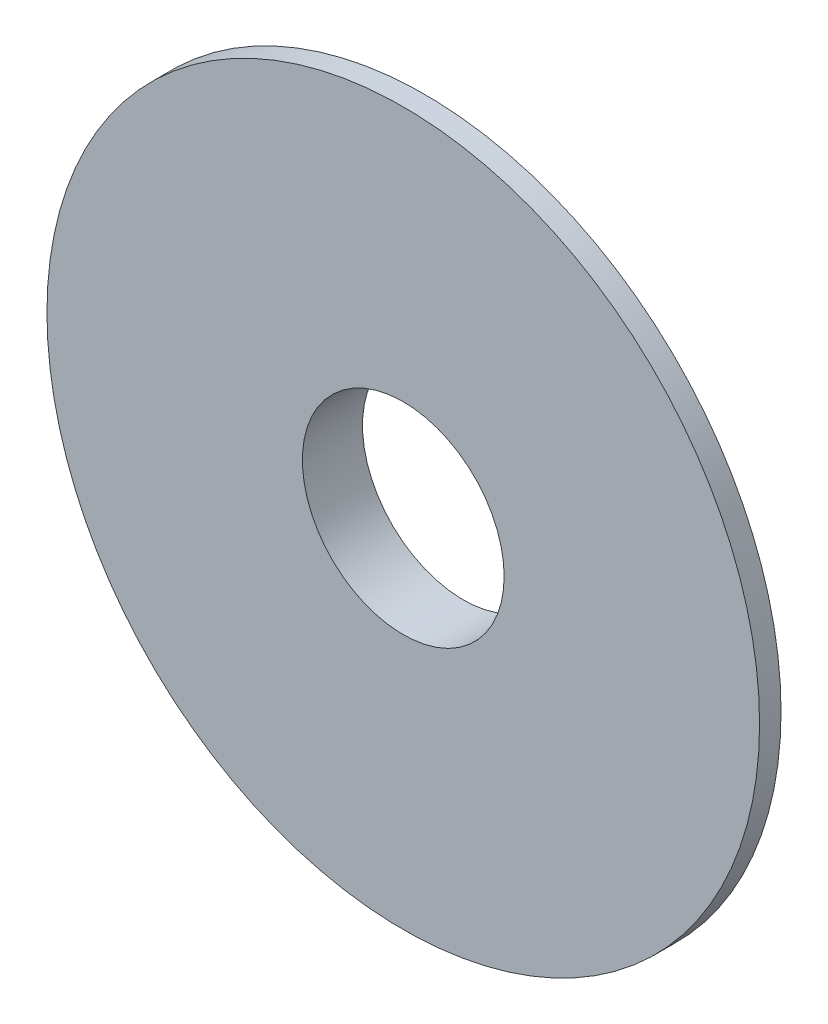
ISO-10303-21;
HEADER;
FILE_DESCRIPTION(('STEP AP214'),'2;1');
FILE_NAME('part.step','',(''),(''),'','','');
FILE_SCHEMA(('AUTOMOTIVE_DESIGN { 1 0 10303 214 1 1 1 1 }'));
ENDSEC;
DATA;
#1=APPLICATION_CONTEXT('core data for automotive mechanical design processes');
#2=APPLICATION_PROTOCOL_DEFINITION('international standard','automotive_design',2000,#1);
#3=PRODUCT_CONTEXT('',#1,'mechanical');
#4=PRODUCT('Part','Part','',(#3));
#5=PRODUCT_RELATED_PRODUCT_CATEGORY('part','',(#4));
#6=PRODUCT_DEFINITION_FORMATION('','',#4);
#7=PRODUCT_DEFINITION_CONTEXT('part definition',#1,'design');
#8=PRODUCT_DEFINITION('design','',#6,#7);
#9=PRODUCT_DEFINITION_SHAPE('','',#8);
#10=(LENGTH_UNIT() NAMED_UNIT(*) SI_UNIT(.MILLI.,.METRE.));
#11=(NAMED_UNIT(*) PLANE_ANGLE_UNIT() SI_UNIT($,.RADIAN.));
#12=(NAMED_UNIT(*) SI_UNIT($,.STERADIAN.) SOLID_ANGLE_UNIT());
#13=UNCERTAINTY_MEASURE_WITH_UNIT(LENGTH_MEASURE(1.E-05),#10,'distance_accuracy_value','');
#14=(GEOMETRIC_REPRESENTATION_CONTEXT(3) GLOBAL_UNCERTAINTY_ASSIGNED_CONTEXT((#13)) GLOBAL_UNIT_ASSIGNED_CONTEXT((#10,
#11,#12)) REPRESENTATION_CONTEXT('',''));
#15=CARTESIAN_POINT('',(0.,0.,0.));
#16=DIRECTION('',(0.,0.,1.));
#17=DIRECTION('',(1.,0.,0.));
#18=AXIS2_PLACEMENT_3D('',#15,#16,#17);
#19=CARTESIAN_POINT('',(0.,0.,35.));
#20=DIRECTION('',(0.,0.,1.));
#21=DIRECTION('',(1.,0.,0.));
#22=AXIS2_PLACEMENT_3D('',#19,#20,#21);
#23=PLANE('',#22);
#24=CARTESIAN_POINT('',(0.,0.,35.));
#25=DIRECTION('',(0.,0.,1.));
#26=DIRECTION('',(1.,0.,0.));
#27=AXIS2_PLACEMENT_3D('',#24,#25,#26);
#28=CIRCLE('',#27,83.);
#29=CARTESIAN_POINT('',(83.,0.,35.));
#30=VERTEX_POINT('',#29);
#31=EDGE_CURVE('E46',#30,#30,#28,.T.);
#32=ORIENTED_EDGE('',*,*,#31,.F.);
#33=EDGE_LOOP('',(#32));
#34=FACE_BOUND('',#33,.T.);
#35=CARTESIAN_POINT('',(0.,0.,35.));
#36=DIRECTION('',(0.,0.,1.));
#37=DIRECTION('',(1.,0.,0.));
#38=AXIS2_PLACEMENT_3D('',#35,#36,#37);
#39=CIRCLE('',#38,27.5);
#40=CARTESIAN_POINT('',(27.5,0.,35.));
#41=VERTEX_POINT('',#40);
#42=EDGE_CURVE('E10',#41,#41,#39,.F.);
#43=ORIENTED_EDGE('',*,*,#42,.F.);
#44=EDGE_LOOP('',(#43));
#45=FACE_BOUND('',#44,.T.);
#46=ADVANCED_FACE('F35',(#34,#45),#23,.F.);
#47=CARTESIAN_POINT('',(0.,0.,40.));
#48=DIRECTION('',(0.,0.,1.));
#49=DIRECTION('',(1.,0.,0.));
#50=AXIS2_PLACEMENT_3D('',#47,#48,#49);
#51=PLANE('',#50);
#52=CARTESIAN_POINT('',(0.,0.,40.));
#53=DIRECTION('',(0.,0.,1.));
#54=DIRECTION('',(1.,0.,0.));
#55=AXIS2_PLACEMENT_3D('',#52,#53,#54);
#56=CIRCLE('',#55,23.5);
#57=CARTESIAN_POINT('',(23.5,0.,40.));
#58=VERTEX_POINT('',#57);
#59=EDGE_CURVE('E51',#58,#58,#56,.T.);
#60=ORIENTED_EDGE('',*,*,#59,.F.);
#61=EDGE_LOOP('',(#60));
#62=FACE_BOUND('',#61,.T.);
#63=CARTESIAN_POINT('',(0.,0.,40.));
#64=DIRECTION('',(0.,0.,1.));
#65=DIRECTION('',(1.,0.,0.));
#66=AXIS2_PLACEMENT_3D('',#63,#64,#65);
#67=CIRCLE('',#66,83.);
#68=CARTESIAN_POINT('',(83.,0.,40.));
#69=VERTEX_POINT('',#68);
#70=EDGE_CURVE('E42',#69,#69,#67,.T.);
#71=ORIENTED_EDGE('',*,*,#70,.T.);
#72=EDGE_LOOP('',(#71));
#73=FACE_BOUND('',#72,.T.);
#74=ADVANCED_FACE('F75',(#62,#73),#51,.T.);
#75=CARTESIAN_POINT('',(0.,0.,40.));
#76=DIRECTION('',(0.,0.,-1.));
#77=DIRECTION('',(-1.,0.,0.));
#78=AXIS2_PLACEMENT_3D('',#75,#76,#77);
#79=CYLINDRICAL_SURFACE('',#78,83.);
#80=ORIENTED_EDGE('',*,*,#70,.F.);
#81=EDGE_LOOP('',(#80));
#82=FACE_BOUND('',#81,.T.);
#83=ORIENTED_EDGE('',*,*,#31,.T.);
#84=EDGE_LOOP('',(#83));
#85=FACE_BOUND('',#84,.T.);
#86=ADVANCED_FACE('F37',(#82,#85),#79,.T.);
#87=CARTESIAN_POINT('',(0.,0.,40.));
#88=DIRECTION('',(0.,0.,-1.));
#89=DIRECTION('',(-1.,0.,0.));
#90=AXIS2_PLACEMENT_3D('',#87,#88,#89);
#91=CYLINDRICAL_SURFACE('',#90,23.5);
#92=ORIENTED_EDGE('',*,*,#59,.T.);
#93=EDGE_LOOP('',(#92));
#94=FACE_BOUND('',#93,.T.);
#95=CARTESIAN_POINT('',(0.,0.,26.));
#96=DIRECTION('',(0.,0.,1.));
#97=DIRECTION('',(1.,0.,0.));
#98=AXIS2_PLACEMENT_3D('',#95,#96,#97);
#99=CIRCLE('',#98,23.5);
#100=CARTESIAN_POINT('',(23.5,0.,26.));
#101=VERTEX_POINT('',#100);
#102=EDGE_CURVE('E58',#101,#101,#99,.T.);
#103=ORIENTED_EDGE('',*,*,#102,.F.);
#104=EDGE_LOOP('',(#103));
#105=FACE_BOUND('',#104,.T.);
#106=ADVANCED_FACE('F64',(#94,#105),#91,.F.);
#107=CARTESIAN_POINT('',(0.,0.,40.));
#108=DIRECTION('',(0.,0.,-1.));
#109=DIRECTION('',(-1.,0.,0.));
#110=AXIS2_PLACEMENT_3D('',#107,#108,#109);
#111=CYLINDRICAL_SURFACE('',#110,27.5);
#112=CARTESIAN_POINT('',(0.,0.,26.));
#113=DIRECTION('',(0.,0.,1.));
#114=DIRECTION('',(1.,0.,0.));
#115=AXIS2_PLACEMENT_3D('',#112,#113,#114);
#116=CIRCLE('',#115,27.5);
#117=CARTESIAN_POINT('',(27.5,0.,26.));
#118=VERTEX_POINT('',#117);
#119=EDGE_CURVE('E55',#118,#118,#116,.T.);
#120=ORIENTED_EDGE('',*,*,#119,.T.);
#121=EDGE_LOOP('',(#120));
#122=FACE_BOUND('',#121,.T.);
#123=ORIENTED_EDGE('',*,*,#42,.T.);
#124=EDGE_LOOP('',(#123));
#125=FACE_BOUND('',#124,.T.);
#126=ADVANCED_FACE('F66',(#122,#125),#111,.T.);
#127=CARTESIAN_POINT('',(0.,0.,26.));
#128=DIRECTION('',(0.,0.,1.));
#129=DIRECTION('',(1.,0.,0.));
#130=AXIS2_PLACEMENT_3D('',#127,#128,#129);
#131=PLANE('',#130);
#132=ORIENTED_EDGE('',*,*,#119,.F.);
#133=EDGE_LOOP('',(#132));
#134=FACE_BOUND('',#133,.T.);
#135=ORIENTED_EDGE('',*,*,#102,.T.);
#136=EDGE_LOOP('',(#135));
#137=FACE_BOUND('',#136,.T.);
#138=ADVANCED_FACE('F62',(#134,#137),#131,.F.);
#139=CLOSED_SHELL('',(#46,#74,#86,#106,#126,#138));
#140=MANIFOLD_SOLID_BREP('B2',#139);
#141=ADVANCED_BREP_SHAPE_REPRESENTATION('',(#18,#140),#14);
#142=SHAPE_DEFINITION_REPRESENTATION(#9,#141);
ENDSEC;
END-ISO-10303-21;
